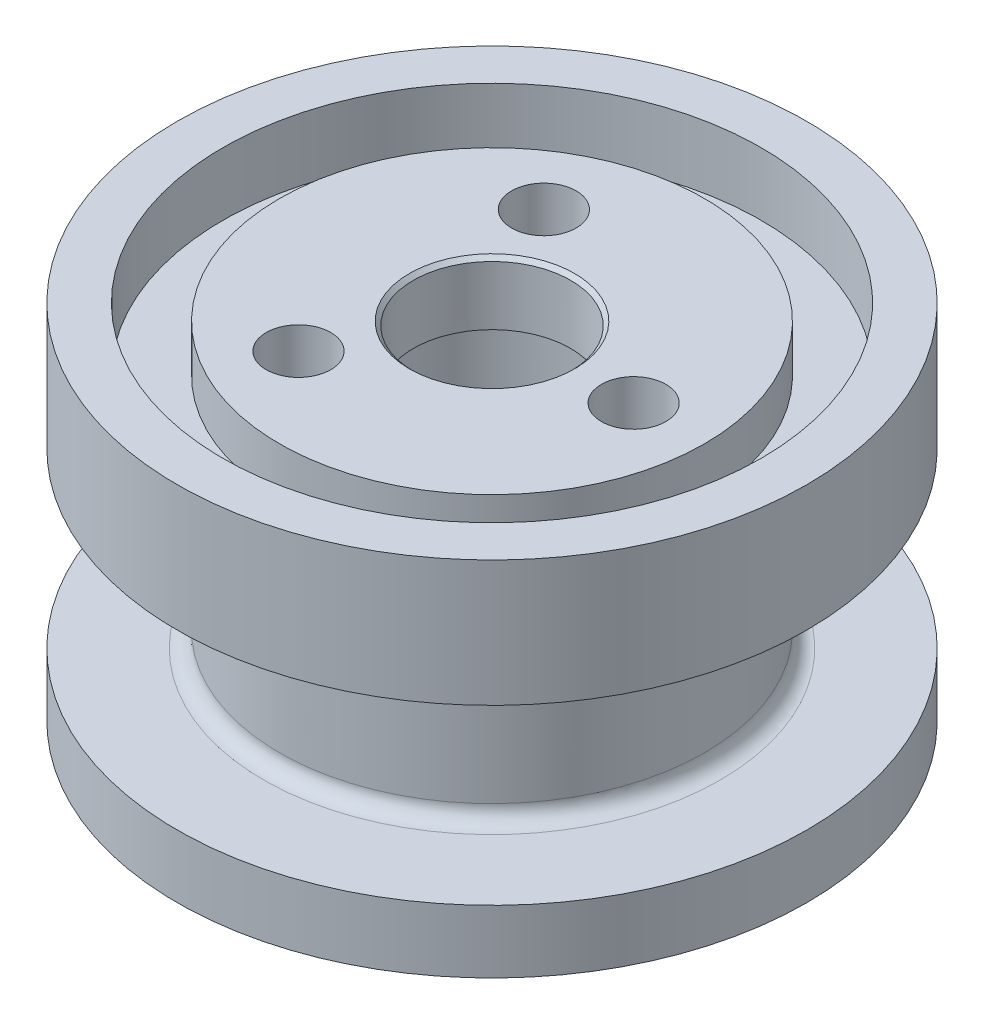
ISO-10303-21;
HEADER;
FILE_DESCRIPTION(('STEP AP214'),'2;1');
FILE_NAME('part.step','',(''),(''),'','','');
FILE_SCHEMA(('AUTOMOTIVE_DESIGN { 1 0 10303 214 1 1 1 1 }'));
ENDSEC;
DATA;
#1=APPLICATION_CONTEXT('core data for automotive mechanical design processes');
#2=APPLICATION_PROTOCOL_DEFINITION('international standard','automotive_design',2000,#1);
#3=PRODUCT_CONTEXT('',#1,'mechanical');
#4=PRODUCT('Part','Part','',(#3));
#5=PRODUCT_RELATED_PRODUCT_CATEGORY('part','',(#4));
#6=PRODUCT_DEFINITION_FORMATION('','',#4);
#7=PRODUCT_DEFINITION_CONTEXT('part definition',#1,'design');
#8=PRODUCT_DEFINITION('design','',#6,#7);
#9=PRODUCT_DEFINITION_SHAPE('','',#8);
#10=(LENGTH_UNIT() NAMED_UNIT(*) SI_UNIT(.MILLI.,.METRE.));
#11=(NAMED_UNIT(*) PLANE_ANGLE_UNIT() SI_UNIT($,.RADIAN.));
#12=(NAMED_UNIT(*) SI_UNIT($,.STERADIAN.) SOLID_ANGLE_UNIT());
#13=UNCERTAINTY_MEASURE_WITH_UNIT(LENGTH_MEASURE(1.E-05),#10,'distance_accuracy_value','');
#14=(GEOMETRIC_REPRESENTATION_CONTEXT(3) GLOBAL_UNCERTAINTY_ASSIGNED_CONTEXT((#13)) GLOBAL_UNIT_ASSIGNED_CONTEXT((#10,
#11,#12)) REPRESENTATION_CONTEXT('',''));
#15=CARTESIAN_POINT('',(0.,0.,0.));
#16=DIRECTION('',(0.,0.,1.));
#17=DIRECTION('',(1.,0.,0.));
#18=AXIS2_PLACEMENT_3D('',#15,#16,#17);
#19=CARTESIAN_POINT('',(0.,0.,0.));
#20=DIRECTION('',(0.,1.,0.));
#21=DIRECTION('',(0.,0.,1.));
#22=AXIS2_PLACEMENT_3D('',#19,#20,#21);
#23=CYLINDRICAL_SURFACE('',#22,6.5);
#24=DIRECTION('',(0.,1.,0.));
#25=VECTOR('',#24,1.);
#26=CARTESIAN_POINT('',(-6.18465843842649,0.,2.));
#27=LINE('',#26,#25);
#28=CARTESIAN_POINT('',(-6.18465843849507,0.250000000116187,2.));
#29=VERTEX_POINT('',#28);
#30=CARTESIAN_POINT('',(-6.18465843842649,6.,2.));
#31=VERTEX_POINT('',#30);
#32=EDGE_CURVE('E61',#29,#31,#27,.T.);
#33=ORIENTED_EDGE('',*,*,#32,.T.);
#34=CARTESIAN_POINT('',(0.,6.,0.));
#35=DIRECTION('',(0.,1.,0.));
#36=DIRECTION('',(0.,0.,1.));
#37=AXIS2_PLACEMENT_3D('',#34,#35,#36);
#38=CIRCLE('',#37,6.5);
#39=CARTESIAN_POINT('',(-6.18465843842649,6.,-2.));
#40=VERTEX_POINT('',#39);
#41=EDGE_CURVE('E20',#31,#40,#38,.F.);
#42=ORIENTED_EDGE('',*,*,#41,.T.);
#43=DIRECTION('',(0.,1.,0.));
#44=VECTOR('',#43,1.);
#45=CARTESIAN_POINT('',(-6.18465843842649,0.,-2.));
#46=LINE('',#45,#44);
#47=CARTESIAN_POINT('',(-6.18465843848511,0.250000000125669,-2.));
#48=VERTEX_POINT('',#47);
#49=EDGE_CURVE('E66',#40,#48,#46,.F.);
#50=ORIENTED_EDGE('',*,*,#49,.T.);
#51=CARTESIAN_POINT('',(0.,0.250000000050932,0.));
#52=DIRECTION('',(0.,-1.,0.));
#53=DIRECTION('',(1.,0.,0.));
#54=AXIS2_PLACEMENT_3D('',#51,#52,#53);
#55=CIRCLE('',#54,6.50000000013051);
#56=EDGE_CURVE('E89',#48,#29,#55,.T.);
#57=ORIENTED_EDGE('',*,*,#56,.T.);
#58=EDGE_LOOP('',(#33,#42,#50,#57));
#59=FACE_BOUND('',#58,.T.);
#60=CARTESIAN_POINT('',(0.,19.5,0.));
#61=DIRECTION('',(0.,-1.,0.));
#62=DIRECTION('',(0.,0.,-1.));
#63=AXIS2_PLACEMENT_3D('',#60,#61,#62);
#64=CIRCLE('',#63,6.5);
#65=CARTESIAN_POINT('',(0.,19.5,-6.5));
#66=VERTEX_POINT('',#65);
#67=EDGE_CURVE('E91',#66,#66,#64,.F.);
#68=ORIENTED_EDGE('',*,*,#67,.T.);
#69=EDGE_LOOP('',(#68));
#70=FACE_BOUND('',#69,.T.);
#71=ADVANCED_FACE('F17',(#59,#70),#23,.F.);
#72=CARTESIAN_POINT('',(-8.,6.,0.));
#73=DIRECTION('',(0.,1.,0.));
#74=DIRECTION('',(0.,0.,1.));
#75=AXIS2_PLACEMENT_3D('',#72,#73,#74);
#76=PLANE('',#75);
#77=DIRECTION('',(1.,0.,0.));
#78=VECTOR('',#77,1.);
#79=CARTESIAN_POINT('',(-0.964836368048555,6.,2.));
#80=LINE('',#79,#78);
#81=CARTESIAN_POINT('',(-8.,6.,2.));
#82=VERTEX_POINT('',#81);
#83=EDGE_CURVE('E85',#31,#82,#80,.F.);
#84=ORIENTED_EDGE('',*,*,#83,.T.);
#85=CARTESIAN_POINT('',(-8.,6.,0.));
#86=DIRECTION('',(0.,1.,0.));
#87=DIRECTION('',(0.,0.,1.));
#88=AXIS2_PLACEMENT_3D('',#85,#86,#87);
#89=CIRCLE('',#88,2.);
#90=CARTESIAN_POINT('',(-8.,6.,-2.));
#91=VERTEX_POINT('',#90);
#92=EDGE_CURVE('E75',#82,#91,#89,.F.);
#93=ORIENTED_EDGE('',*,*,#92,.T.);
#94=DIRECTION('',(-1.,0.,0.));
#95=VECTOR('',#94,1.);
#96=CARTESIAN_POINT('',(-8.,6.,-2.));
#97=LINE('',#96,#95);
#98=EDGE_CURVE('E72',#91,#40,#97,.F.);
#99=ORIENTED_EDGE('',*,*,#98,.T.);
#100=ORIENTED_EDGE('',*,*,#41,.F.);
#101=EDGE_LOOP('',(#84,#93,#99,#100));
#102=FACE_BOUND('',#101,.T.);
#103=ADVANCED_FACE('F73',(#102),#76,.F.);
#104=CARTESIAN_POINT('',(-8.,0.,-2.));
#105=DIRECTION('',(0.,0.,-1.));
#106=DIRECTION('',(-1.,0.,0.));
#107=AXIS2_PLACEMENT_3D('',#104,#105,#106);
#108=PLANE('',#107);
#109=ORIENTED_EDGE('',*,*,#49,.F.);
#110=ORIENTED_EDGE('',*,*,#98,.F.);
#111=DIRECTION('',(0.,1.,0.));
#112=VECTOR('',#111,1.);
#113=CARTESIAN_POINT('',(-8.,0.,-2.));
#114=LINE('',#113,#112);
#115=CARTESIAN_POINT('',(-8.,0.,-2.));
#116=VERTEX_POINT('',#115);
#117=EDGE_CURVE('E156',#91,#116,#114,.F.);
#118=ORIENTED_EDGE('',*,*,#117,.T.);
#119=DIRECTION('',(-1.,0.,0.));
#120=VECTOR('',#119,1.);
#121=CARTESIAN_POINT('',(-8.,0.,-2.));
#122=LINE('',#121,#120);
#123=CARTESIAN_POINT('',(-6.44689847891693,-8.5264717738512E-11,-2.));
#124=VERTEX_POINT('',#123);
#125=EDGE_CURVE('E70',#124,#116,#122,.T.);
#126=ORIENTED_EDGE('',*,*,#125,.F.);
#127=CARTESIAN_POINT('',(-6.44689847901615,-1.42911803351234E-10,-2.0000000000332));
#128=CARTESIAN_POINT('',(-6.40323119374315,0.0417079827790319,-2.0000000000166));
#129=CARTESIAN_POINT('',(-6.35954421449282,0.0833953075033397,-2.00000000000553));
#130=CARTESIAN_POINT('',(-6.27213086766901,0.166728640907955,-1.99999999999447));
#131=CARTESIAN_POINT('',(-6.22840450009521,0.208374649587915,-1.99999999999447));
#132=CARTESIAN_POINT('',(-6.18465843854373,0.25000000006989,-2.));
#133=B_SPLINE_CURVE_WITH_KNOTS('',3,(#127,#128,#129,#130,#131,#132),.UNSPECIFIED.,.F.,.F.,(4,2,
4),(0.,0.181155918446515,0.36231183842027),.UNSPECIFIED.);
#134=EDGE_CURVE('E82',#124,#48,#133,.T.);
#135=ORIENTED_EDGE('',*,*,#134,.T.);
#136=EDGE_LOOP('',(#109,#110,#118,#126,#135));
#137=FACE_BOUND('',#136,.T.);
#138=ADVANCED_FACE('F80',(#137),#108,.F.);
#139=CARTESIAN_POINT('',(-0.964836368048555,0.,2.));
#140=DIRECTION('',(0.,0.,1.));
#141=DIRECTION('',(1.,0.,0.));
#142=AXIS2_PLACEMENT_3D('',#139,#140,#141);
#143=PLANE('',#142);
#144=DIRECTION('',(1.,0.,0.));
#145=VECTOR('',#144,1.);
#146=CARTESIAN_POINT('',(-0.964836368048555,0.,2.));
#147=LINE('',#146,#145);
#148=CARTESIAN_POINT('',(-8.,0.,2.));
#149=VERTEX_POINT('',#148);
#150=CARTESIAN_POINT('',(-6.44689847891693,-8.5264717738512E-11,2.));
#151=VERTEX_POINT('',#150);
#152=EDGE_CURVE('E35',#149,#151,#147,.T.);
#153=ORIENTED_EDGE('',*,*,#152,.F.);
#154=DIRECTION('',(0.,1.,0.));
#155=VECTOR('',#154,1.);
#156=CARTESIAN_POINT('',(-8.,0.,2.));
#157=LINE('',#156,#155);
#158=EDGE_CURVE('E191',#149,#82,#157,.T.);
#159=ORIENTED_EDGE('',*,*,#158,.T.);
#160=ORIENTED_EDGE('',*,*,#83,.F.);
#161=ORIENTED_EDGE('',*,*,#32,.F.);
#162=CARTESIAN_POINT('',(-6.18465843854105,0.250000000067085,1.99999999999516));
#163=CARTESIAN_POINT('',(-6.22840450009696,0.208374649589746,1.99999999999758));
#164=CARTESIAN_POINT('',(-6.27213086767166,0.16672864091072,1.99999999999919));
#165=CARTESIAN_POINT('',(-6.35954421449019,0.0833953075005585,2.00000000000081));
#166=CARTESIAN_POINT('',(-6.40323119373435,0.0417079827697724,2.00000000000081));
#167=CARTESIAN_POINT('',(-6.44689847899765,-1.62354135352145E-10,2.));
#168=B_SPLINE_CURVE_WITH_KNOTS('',3,(#162,#163,#164,#165,#166,#167),.UNSPECIFIED.,.F.,.F.,(4,2,
4),(0.,0.181155919973771,0.362311838420312),.UNSPECIFIED.);
#169=EDGE_CURVE('E90',#29,#151,#168,.T.);
#170=ORIENTED_EDGE('',*,*,#169,.T.);
#171=EDGE_LOOP('',(#153,#159,#160,#161,#170));
#172=FACE_BOUND('',#171,.T.);
#173=ADVANCED_FACE('F184',(#172),#143,.F.);
#174=CARTESIAN_POINT('',(0.,19.5,0.));
#175=DIRECTION('',(0.,-1.,0.));
#176=DIRECTION('',(0.,0.,-1.));
#177=AXIS2_PLACEMENT_3D('',#174,#175,#176);
#178=TOROIDAL_SURFACE('',#177,6.,0.5);
#179=CARTESIAN_POINT('',(0.,20.,0.));
#180=DIRECTION('',(0.,1.,0.));
#181=DIRECTION('',(1.,0.,0.));
#182=AXIS2_PLACEMENT_3D('',#179,#180,#181);
#183=CIRCLE('',#182,6.);
#184=CARTESIAN_POINT('',(6.,20.,0.));
#185=VERTEX_POINT('',#184);
#186=EDGE_CURVE('E154',#185,#185,#183,.T.);
#187=ORIENTED_EDGE('',*,*,#186,.T.);
#188=EDGE_LOOP('',(#187));
#189=FACE_BOUND('',#188,.T.);
#190=ORIENTED_EDGE('',*,*,#67,.F.);
#191=EDGE_LOOP('',(#190));
#192=FACE_BOUND('',#191,.T.);
#193=ADVANCED_FACE('F179',(#189,#192),#178,.F.);
#194=CARTESIAN_POINT('',(0.,1.,0.));
#195=DIRECTION('',(0.,-1.,0.));
#196=DIRECTION('',(1.,0.,0.));
#197=AXIS2_PLACEMENT_3D('',#194,#195,#196);
#198=CYLINDRICAL_SURFACE('',#197,16.);
#199=CARTESIAN_POINT('',(0.,2.,0.));
#200=DIRECTION('',(0.,-1.,0.));
#201=DIRECTION('',(1.,0.,0.));
#202=AXIS2_PLACEMENT_3D('',#199,#200,#201);
#203=CIRCLE('',#202,16.);
#204=CARTESIAN_POINT('',(16.,2.,0.));
#205=VERTEX_POINT('',#204);
#206=EDGE_CURVE('E151',#205,#205,#203,.F.);
#207=ORIENTED_EDGE('',*,*,#206,.F.);
#208=EDGE_LOOP('',(#207));
#209=FACE_BOUND('',#208,.T.);
#210=CARTESIAN_POINT('',(0.,0.,0.));
#211=DIRECTION('',(0.,-1.,0.));
#212=DIRECTION('',(1.,0.,0.));
#213=AXIS2_PLACEMENT_3D('',#210,#211,#212);
#214=CIRCLE('',#213,16.);
#215=CARTESIAN_POINT('',(16.,0.,0.));
#216=VERTEX_POINT('',#215);
#217=EDGE_CURVE('E148',#216,#216,#214,.T.);
#218=ORIENTED_EDGE('',*,*,#217,.F.);
#219=EDGE_LOOP('',(#218));
#220=FACE_BOUND('',#219,.T.);
#221=ADVANCED_FACE('F173',(#209,#220),#198,.T.);
#222=CARTESIAN_POINT('',(0.,-1.13686837721616E-10,0.));
#223=DIRECTION('',(0.,-1.,0.));
#224=DIRECTION('',(0.,0.,-1.));
#225=AXIS2_PLACEMENT_3D('',#222,#223,#224);
#226=CONICAL_SURFACE('',#225,6.74999999984038,0.785398162487954);
#227=CARTESIAN_POINT('',(0.,-1.70530256582424E-10,0.));
#228=DIRECTION('',(0.,-1.,0.));
#229=DIRECTION('',(0.,0.,-1.));
#230=AXIS2_PLACEMENT_3D('',#227,#228,#229);
#231=CIRCLE('',#230,6.74999999989723);
#232=EDGE_CURVE('E145',#151,#124,#231,.F.);
#233=ORIENTED_EDGE('',*,*,#232,.F.);
#234=ORIENTED_EDGE('',*,*,#169,.F.);
#235=ORIENTED_EDGE('',*,*,#56,.F.);
#236=ORIENTED_EDGE('',*,*,#134,.F.);
#237=EDGE_LOOP('',(#233,#234,#235,#236));
#238=FACE_BOUND('',#237,.T.);
#239=ADVANCED_FACE('F167',(#238),#226,.F.);
#240=CARTESIAN_POINT('',(-8.,0.,0.));
#241=DIRECTION('',(0.,1.,0.));
#242=DIRECTION('',(0.,0.,1.));
#243=AXIS2_PLACEMENT_3D('',#240,#241,#242);
#244=CYLINDRICAL_SURFACE('',#243,2.);
#245=CARTESIAN_POINT('',(-8.,0.,0.));
#246=DIRECTION('',(0.,1.,0.));
#247=DIRECTION('',(0.,0.,1.));
#248=AXIS2_PLACEMENT_3D('',#245,#246,#247);
#249=CIRCLE('',#248,2.);
#250=EDGE_CURVE('E142',#116,#149,#249,.T.);
#251=ORIENTED_EDGE('',*,*,#250,.F.);
#252=ORIENTED_EDGE('',*,*,#117,.F.);
#253=ORIENTED_EDGE('',*,*,#92,.F.);
#254=ORIENTED_EDGE('',*,*,#158,.F.);
#255=EDGE_LOOP('',(#251,#252,#253,#254));
#256=FACE_BOUND('',#255,.T.);
#257=ADVANCED_FACE('F172',(#256),#244,.F.);
#258=CARTESIAN_POINT('',(0.,20.,0.));
#259=DIRECTION('',(0.,1.,0.));
#260=DIRECTION('',(0.,0.,1.));
#261=AXIS2_PLACEMENT_3D('',#258,#259,#260);
#262=PLANE('',#261);
#263=CARTESIAN_POINT('',(0.,20.,0.));
#264=DIRECTION('',(0.,-1.,0.));
#265=DIRECTION('',(1.,0.,0.));
#266=AXIS2_PLACEMENT_3D('',#263,#264,#265);
#267=CIRCLE('',#266,5.);
#268=CARTESIAN_POINT('',(5.,20.,0.));
#269=VERTEX_POINT('',#268);
#270=EDGE_CURVE('E139',#269,#269,#267,.F.);
#271=ORIENTED_EDGE('',*,*,#270,.T.);
#272=EDGE_LOOP('',(#271));
#273=FACE_BOUND('',#272,.T.);
#274=ORIENTED_EDGE('',*,*,#186,.F.);
#275=EDGE_LOOP('',(#274));
#276=FACE_BOUND('',#275,.T.);
#277=ADVANCED_FACE('F308',(#273,#276),#262,.F.);
#278=CARTESIAN_POINT('',(18.,2.,0.));
#279=DIRECTION('',(0.,-1.,0.));
#280=DIRECTION('',(0.,0.,-1.));
#281=AXIS2_PLACEMENT_3D('',#278,#279,#280);
#282=PLANE('',#281);
#283=ORIENTED_EDGE('',*,*,#206,.T.);
#284=EDGE_LOOP('',(#283));
#285=FACE_BOUND('',#284,.T.);
#286=CARTESIAN_POINT('',(0.,2.,0.));
#287=DIRECTION('',(0.,-1.,0.));
#288=DIRECTION('',(1.,0.,0.));
#289=AXIS2_PLACEMENT_3D('',#286,#287,#288);
#290=CIRCLE('',#289,20.);
#291=CARTESIAN_POINT('',(20.,2.,0.));
#292=VERTEX_POINT('',#291);
#293=EDGE_CURVE('E136',#292,#292,#290,.F.);
#294=ORIENTED_EDGE('',*,*,#293,.F.);
#295=EDGE_LOOP('',(#294));
#296=FACE_BOUND('',#295,.T.);
#297=ADVANCED_FACE('F317',(#285,#296),#282,.T.);
#298=CARTESIAN_POINT('',(8.,0.,0.));
#299=DIRECTION('',(0.,-1.,0.));
#300=DIRECTION('',(0.,0.,-1.));
#301=AXIS2_PLACEMENT_3D('',#298,#299,#300);
#302=PLANE('',#301);
#303=CARTESIAN_POINT('',(-4.5,0.,-7.79422863405995));
#304=DIRECTION('',(0.,-1.,0.));
#305=DIRECTION('',(0.,0.,-1.));
#306=AXIS2_PLACEMENT_3D('',#303,#304,#305);
#307=CIRCLE('',#306,2.05);
#308=CARTESIAN_POINT('',(-4.5,0.,-9.84422863405995));
#309=VERTEX_POINT('',#308);
#310=EDGE_CURVE('E127',#309,#309,#307,.F.);
#311=ORIENTED_EDGE('',*,*,#310,.T.);
#312=EDGE_LOOP('',(#311));
#313=FACE_BOUND('',#312,.T.);
#314=CARTESIAN_POINT('',(-4.5,0.,7.79422863405995));
#315=DIRECTION('',(0.,-1.,0.));
#316=DIRECTION('',(0.,0.,-1.));
#317=AXIS2_PLACEMENT_3D('',#314,#315,#316);
#318=CIRCLE('',#317,2.05);
#319=CARTESIAN_POINT('',(-4.5,0.,5.74422863405995));
#320=VERTEX_POINT('',#319);
#321=EDGE_CURVE('E130',#320,#320,#318,.F.);
#322=ORIENTED_EDGE('',*,*,#321,.T.);
#323=EDGE_LOOP('',(#322));
#324=FACE_BOUND('',#323,.T.);
#325=CARTESIAN_POINT('',(9.,0.,0.));
#326=DIRECTION('',(0.,-1.,0.));
#327=DIRECTION('',(1.,0.,0.));
#328=AXIS2_PLACEMENT_3D('',#325,#326,#327);
#329=CIRCLE('',#328,2.05);
#330=CARTESIAN_POINT('',(11.05,0.,0.));
#331=VERTEX_POINT('',#330);
#332=EDGE_CURVE('E133',#331,#331,#329,.F.);
#333=ORIENTED_EDGE('',*,*,#332,.T.);
#334=EDGE_LOOP('',(#333));
#335=FACE_BOUND('',#334,.T.);
#336=ORIENTED_EDGE('',*,*,#250,.T.);
#337=ORIENTED_EDGE('',*,*,#152,.T.);
#338=ORIENTED_EDGE('',*,*,#232,.T.);
#339=ORIENTED_EDGE('',*,*,#125,.T.);
#340=EDGE_LOOP('',(#336,#337,#338,#339));
#341=FACE_BOUND('',#340,.T.);
#342=ORIENTED_EDGE('',*,*,#217,.T.);
#343=EDGE_LOOP('',(#342));
#344=FACE_BOUND('',#343,.T.);
#345=ADVANCED_FACE('F209',(#313,#324,#335,#341,#344),#302,.T.);
#346=CARTESIAN_POINT('',(0.,61.8465843842649,0.));
#347=DIRECTION('',(0.,-1.,0.));
#348=DIRECTION('',(1.,0.,0.));
#349=AXIS2_PLACEMENT_3D('',#346,#347,#348);
#350=CYLINDRICAL_SURFACE('',#349,5.);
#351=CARTESIAN_POINT('',(0.,23.7499999998363,0.));
#352=DIRECTION('',(0.,1.,0.));
#353=DIRECTION('',(1.,0.,0.));
#354=AXIS2_PLACEMENT_3D('',#351,#352,#353);
#355=CIRCLE('',#354,5.00000000016598);
#356=CARTESIAN_POINT('',(5.00000000016598,23.7499999998363,0.));
#357=VERTEX_POINT('',#356);
#358=EDGE_CURVE('E126',#357,#357,#355,.T.);
#359=ORIENTED_EDGE('',*,*,#358,.T.);
#360=EDGE_LOOP('',(#359));
#361=FACE_BOUND('',#360,.T.);
#362=ORIENTED_EDGE('',*,*,#270,.F.);
#363=EDGE_LOOP('',(#362));
#364=FACE_BOUND('',#363,.T.);
#365=ADVANCED_FACE('F324',(#361,#364),#350,.F.);
#366=CARTESIAN_POINT('',(0.,4.,0.));
#367=DIRECTION('',(0.,-1.,0.));
#368=DIRECTION('',(1.,0.,0.));
#369=AXIS2_PLACEMENT_3D('',#366,#367,#368);
#370=CYLINDRICAL_SURFACE('',#369,20.);
#371=CARTESIAN_POINT('',(0.,6.,0.));
#372=DIRECTION('',(0.,-1.,0.));
#373=DIRECTION('',(1.,0.,0.));
#374=AXIS2_PLACEMENT_3D('',#371,#372,#373);
#375=CIRCLE('',#374,20.);
#376=CARTESIAN_POINT('',(20.,6.,0.));
#377=VERTEX_POINT('',#376);
#378=EDGE_CURVE('E123',#377,#377,#375,.F.);
#379=ORIENTED_EDGE('',*,*,#378,.F.);
#380=EDGE_LOOP('',(#379));
#381=FACE_BOUND('',#380,.T.);
#382=ORIENTED_EDGE('',*,*,#293,.T.);
#383=EDGE_LOOP('',(#382));
#384=FACE_BOUND('',#383,.T.);
#385=ADVANCED_FACE('F328',(#381,#384),#370,.T.);
#386=CARTESIAN_POINT('',(9.,61.8465843842649,0.));
#387=DIRECTION('',(0.,-1.,0.));
#388=DIRECTION('',(1.,0.,0.));
#389=AXIS2_PLACEMENT_3D('',#386,#387,#388);
#390=CYLINDRICAL_SURFACE('',#389,2.05);
#391=ORIENTED_EDGE('',*,*,#332,.F.);
#392=EDGE_LOOP('',(#391));
#393=FACE_BOUND('',#392,.T.);
#394=CARTESIAN_POINT('',(9.,24.,0.));
#395=DIRECTION('',(0.,-1.,0.));
#396=DIRECTION('',(1.,0.,0.));
#397=AXIS2_PLACEMENT_3D('',#394,#395,#396);
#398=CIRCLE('',#397,2.05);
#399=CARTESIAN_POINT('',(11.05,24.,0.));
#400=VERTEX_POINT('',#399);
#401=EDGE_CURVE('E120',#400,#400,#398,.T.);
#402=ORIENTED_EDGE('',*,*,#401,.F.);
#403=EDGE_LOOP('',(#402));
#404=FACE_BOUND('',#403,.T.);
#405=ADVANCED_FACE('F332',(#393,#404),#390,.F.);
#406=CARTESIAN_POINT('',(-4.5,61.8465843842649,7.79422863405995));
#407=DIRECTION('',(0.,-1.,0.));
#408=DIRECTION('',(0.,0.,-1.));
#409=AXIS2_PLACEMENT_3D('',#406,#407,#408);
#410=CYLINDRICAL_SURFACE('',#409,2.05);
#411=ORIENTED_EDGE('',*,*,#321,.F.);
#412=EDGE_LOOP('',(#411));
#413=FACE_BOUND('',#412,.T.);
#414=CARTESIAN_POINT('',(-4.5,24.,7.79422863405995));
#415=DIRECTION('',(0.,-1.,0.));
#416=DIRECTION('',(0.,0.,-1.));
#417=AXIS2_PLACEMENT_3D('',#414,#415,#416);
#418=CIRCLE('',#417,2.05);
#419=CARTESIAN_POINT('',(-4.5,24.,5.74422863405995));
#420=VERTEX_POINT('',#419);
#421=EDGE_CURVE('E117',#420,#420,#418,.T.);
#422=ORIENTED_EDGE('',*,*,#421,.F.);
#423=EDGE_LOOP('',(#422));
#424=FACE_BOUND('',#423,.T.);
#425=ADVANCED_FACE('F336',(#413,#424),#410,.F.);
#426=CARTESIAN_POINT('',(-4.5,61.8465843842649,-7.79422863405995));
#427=DIRECTION('',(0.,-1.,0.));
#428=DIRECTION('',(0.,0.,-1.));
#429=AXIS2_PLACEMENT_3D('',#426,#427,#428);
#430=CYLINDRICAL_SURFACE('',#429,2.05);
#431=ORIENTED_EDGE('',*,*,#310,.F.);
#432=EDGE_LOOP('',(#431));
#433=FACE_BOUND('',#432,.T.);
#434=CARTESIAN_POINT('',(-4.5,24.,-7.79422863405995));
#435=DIRECTION('',(0.,-1.,0.));
#436=DIRECTION('',(0.,0.,-1.));
#437=AXIS2_PLACEMENT_3D('',#434,#435,#436);
#438=CIRCLE('',#437,2.05);
#439=CARTESIAN_POINT('',(-4.5,24.,-9.84422863405995));
#440=VERTEX_POINT('',#439);
#441=EDGE_CURVE('E114',#440,#440,#438,.T.);
#442=ORIENTED_EDGE('',*,*,#441,.F.);
#443=EDGE_LOOP('',(#442));
#444=FACE_BOUND('',#443,.T.);
#445=ADVANCED_FACE('F340',(#433,#444),#430,.F.);
#446=CARTESIAN_POINT('',(0.,24.0000000000009,0.));
#447=DIRECTION('',(0.,1.,0.));
#448=DIRECTION('',(0.,0.,1.));
#449=AXIS2_PLACEMENT_3D('',#446,#447,#448);
#450=CONICAL_SURFACE('',#449,5.24999999987585,0.785398162487954);
#451=CARTESIAN_POINT('',(0.,24.0000000000578,0.));
#452=DIRECTION('',(0.,1.,0.));
#453=DIRECTION('',(0.,0.,1.));
#454=AXIS2_PLACEMENT_3D('',#451,#452,#453);
#455=CIRCLE('',#454,5.2499999999327);
#456=CARTESIAN_POINT('',(0.,24.0000000000578,5.2499999999327));
#457=VERTEX_POINT('',#456);
#458=EDGE_CURVE('E111',#457,#457,#455,.F.);
#459=ORIENTED_EDGE('',*,*,#458,.F.);
#460=EDGE_LOOP('',(#459));
#461=FACE_BOUND('',#460,.T.);
#462=ORIENTED_EDGE('',*,*,#358,.F.);
#463=EDGE_LOOP('',(#462));
#464=FACE_BOUND('',#463,.T.);
#465=ADVANCED_FACE('F344',(#461,#464),#450,.F.);
#466=CARTESIAN_POINT('',(16.75,6.,0.));
#467=DIRECTION('',(0.,1.,0.));
#468=DIRECTION('',(0.,0.,1.));
#469=AXIS2_PLACEMENT_3D('',#466,#467,#468);
#470=PLANE('',#469);
#471=CARTESIAN_POINT('',(0.,6.,0.));
#472=DIRECTION('',(0.,1.,0.));
#473=DIRECTION('',(1.,0.,0.));
#474=AXIS2_PLACEMENT_3D('',#471,#472,#473);
#475=CIRCLE('',#474,14.5);
#476=CARTESIAN_POINT('',(14.5,6.,0.));
#477=VERTEX_POINT('',#476);
#478=EDGE_CURVE('E110',#477,#477,#475,.F.);
#479=ORIENTED_EDGE('',*,*,#478,.T.);
#480=EDGE_LOOP('',(#479));
#481=FACE_BOUND('',#480,.T.);
#482=ORIENTED_EDGE('',*,*,#378,.T.);
#483=EDGE_LOOP('',(#482));
#484=FACE_BOUND('',#483,.T.);
#485=ADVANCED_FACE('F347',(#481,#484),#470,.T.);
#486=CARTESIAN_POINT('',(6.75,24.,0.));
#487=DIRECTION('',(0.,1.,0.));
#488=DIRECTION('',(0.,0.,1.));
#489=AXIS2_PLACEMENT_3D('',#486,#487,#488);
#490=PLANE('',#489);
#491=ORIENTED_EDGE('',*,*,#458,.T.);
#492=EDGE_LOOP('',(#491));
#493=FACE_BOUND('',#492,.T.);
#494=ORIENTED_EDGE('',*,*,#441,.T.);
#495=EDGE_LOOP('',(#494));
#496=FACE_BOUND('',#495,.T.);
#497=ORIENTED_EDGE('',*,*,#421,.T.);
#498=EDGE_LOOP('',(#497));
#499=FACE_BOUND('',#498,.T.);
#500=ORIENTED_EDGE('',*,*,#401,.T.);
#501=EDGE_LOOP('',(#500));
#502=FACE_BOUND('',#501,.T.);
#503=CARTESIAN_POINT('',(0.,24.,0.));
#504=DIRECTION('',(0.,-1.,0.));
#505=DIRECTION('',(1.,0.,0.));
#506=AXIS2_PLACEMENT_3D('',#503,#504,#505);
#507=CIRCLE('',#506,13.5);
#508=CARTESIAN_POINT('',(13.5,24.,0.));
#509=VERTEX_POINT('',#508);
#510=EDGE_CURVE('E107',#509,#509,#507,.T.);
#511=ORIENTED_EDGE('',*,*,#510,.F.);
#512=EDGE_LOOP('',(#511));
#513=FACE_BOUND('',#512,.T.);
#514=ADVANCED_FACE('F286',(#493,#496,#499,#502,#513),#490,.T.);
#515=CARTESIAN_POINT('',(0.,7.,0.));
#516=DIRECTION('',(0.,-1.,0.));
#517=DIRECTION('',(0.,0.,-1.));
#518=AXIS2_PLACEMENT_3D('',#515,#516,#517);
#519=TOROIDAL_SURFACE('',#518,14.5,1.);
#520=ORIENTED_EDGE('',*,*,#478,.F.);
#521=EDGE_LOOP('',(#520));
#522=FACE_BOUND('',#521,.T.);
#523=CARTESIAN_POINT('',(0.,7.,0.));
#524=DIRECTION('',(0.,-1.,0.));
#525=DIRECTION('',(1.,0.,0.));
#526=AXIS2_PLACEMENT_3D('',#523,#524,#525);
#527=CIRCLE('',#526,13.5);
#528=CARTESIAN_POINT('',(13.5,7.,0.));
#529=VERTEX_POINT('',#528);
#530=EDGE_CURVE('E106',#529,#529,#527,.F.);
#531=ORIENTED_EDGE('',*,*,#530,.F.);
#532=EDGE_LOOP('',(#531));
#533=FACE_BOUND('',#532,.T.);
#534=ADVANCED_FACE('F280',(#522,#533),#519,.F.);
#535=CARTESIAN_POINT('',(0.,22.5,0.));
#536=DIRECTION('',(0.,-1.,0.));
#537=DIRECTION('',(1.,0.,0.));
#538=AXIS2_PLACEMENT_3D('',#535,#536,#537);
#539=CYLINDRICAL_SURFACE('',#538,13.5);
#540=ORIENTED_EDGE('',*,*,#510,.T.);
#541=EDGE_LOOP('',(#540));
#542=FACE_BOUND('',#541,.T.);
#543=CARTESIAN_POINT('',(0.,21.,0.));
#544=DIRECTION('',(0.,-1.,0.));
#545=DIRECTION('',(1.,0.,0.));
#546=AXIS2_PLACEMENT_3D('',#543,#544,#545);
#547=CIRCLE('',#546,13.5);
#548=CARTESIAN_POINT('',(13.5,21.,0.));
#549=VERTEX_POINT('',#548);
#550=EDGE_CURVE('E103',#549,#549,#547,.T.);
#551=ORIENTED_EDGE('',*,*,#550,.F.);
#552=EDGE_LOOP('',(#551));
#553=FACE_BOUND('',#552,.T.);
#554=ADVANCED_FACE('F285',(#542,#553),#539,.T.);
#555=CARTESIAN_POINT('',(0.,11.5,0.));
#556=DIRECTION('',(0.,-1.,0.));
#557=DIRECTION('',(1.,0.,0.));
#558=AXIS2_PLACEMENT_3D('',#555,#556,#557);
#559=CYLINDRICAL_SURFACE('',#558,13.5);
#560=ORIENTED_EDGE('',*,*,#530,.T.);
#561=EDGE_LOOP('',(#560));
#562=FACE_BOUND('',#561,.T.);
#563=CARTESIAN_POINT('',(0.,16.,0.));
#564=DIRECTION('',(0.,-1.,0.));
#565=DIRECTION('',(0.,0.,-1.));
#566=AXIS2_PLACEMENT_3D('',#563,#564,#565);
#567=CIRCLE('',#566,13.5);
#568=CARTESIAN_POINT('',(0.,16.,-13.5));
#569=VERTEX_POINT('',#568);
#570=EDGE_CURVE('E102',#569,#569,#567,.T.);
#571=ORIENTED_EDGE('',*,*,#570,.T.);
#572=EDGE_LOOP('',(#571));
#573=FACE_BOUND('',#572,.T.);
#574=ADVANCED_FACE('F371',(#562,#573),#559,.T.);
#575=CARTESIAN_POINT('',(15.3,21.,0.));
#576=DIRECTION('',(0.,1.,0.));
#577=DIRECTION('',(0.,0.,1.));
#578=AXIS2_PLACEMENT_3D('',#575,#576,#577);
#579=PLANE('',#578);
#580=ORIENTED_EDGE('',*,*,#550,.T.);
#581=EDGE_LOOP('',(#580));
#582=FACE_BOUND('',#581,.T.);
#583=CARTESIAN_POINT('',(0.,21.,0.));
#584=DIRECTION('',(0.,-1.,0.));
#585=DIRECTION('',(1.,0.,0.));
#586=AXIS2_PLACEMENT_3D('',#583,#584,#585);
#587=CIRCLE('',#586,17.1);
#588=CARTESIAN_POINT('',(17.1,21.,0.));
#589=VERTEX_POINT('',#588);
#590=EDGE_CURVE('E99',#589,#589,#587,.F.);
#591=ORIENTED_EDGE('',*,*,#590,.T.);
#592=EDGE_LOOP('',(#591));
#593=FACE_BOUND('',#592,.T.);
#594=ADVANCED_FACE('F257',(#582,#593),#579,.T.);
#595=CARTESIAN_POINT('',(0.,16.,0.));
#596=DIRECTION('',(0.,-1.,0.));
#597=DIRECTION('',(0.,0.,-1.));
#598=AXIS2_PLACEMENT_3D('',#595,#596,#597);
#599=TOROIDAL_SURFACE('',#598,14.5,1.);
#600=ORIENTED_EDGE('',*,*,#570,.F.);
#601=EDGE_LOOP('',(#600));
#602=FACE_BOUND('',#601,.T.);
#603=CARTESIAN_POINT('',(0.,17.,0.));
#604=DIRECTION('',(0.,-1.,0.));
#605=DIRECTION('',(1.,0.,0.));
#606=AXIS2_PLACEMENT_3D('',#603,#604,#605);
#607=CIRCLE('',#606,14.5);
#608=CARTESIAN_POINT('',(14.5,17.,0.));
#609=VERTEX_POINT('',#608);
#610=EDGE_CURVE('E98',#609,#609,#607,.F.);
#611=ORIENTED_EDGE('',*,*,#610,.F.);
#612=EDGE_LOOP('',(#611));
#613=FACE_BOUND('',#612,.T.);
#614=ADVANCED_FACE('F253',(#602,#613),#599,.F.);
#615=CARTESIAN_POINT('',(0.,23.,0.));
#616=DIRECTION('',(0.,-1.,0.));
#617=DIRECTION('',(1.,0.,0.));
#618=AXIS2_PLACEMENT_3D('',#615,#616,#617);
#619=CYLINDRICAL_SURFACE('',#618,17.1);
#620=ORIENTED_EDGE('',*,*,#590,.F.);
#621=EDGE_LOOP('',(#620));
#622=FACE_BOUND('',#621,.T.);
#623=CARTESIAN_POINT('',(0.,25.,0.));
#624=DIRECTION('',(0.,-1.,0.));
#625=DIRECTION('',(1.,0.,0.));
#626=AXIS2_PLACEMENT_3D('',#623,#624,#625);
#627=CIRCLE('',#626,17.1);
#628=CARTESIAN_POINT('',(17.1,25.,0.));
#629=VERTEX_POINT('',#628);
#630=EDGE_CURVE('E95',#629,#629,#627,.T.);
#631=ORIENTED_EDGE('',*,*,#630,.F.);
#632=EDGE_LOOP('',(#631));
#633=FACE_BOUND('',#632,.T.);
#634=ADVANCED_FACE('F236',(#622,#633),#619,.F.);
#635=CARTESIAN_POINT('',(16.75,17.,0.));
#636=DIRECTION('',(0.,-1.,0.));
#637=DIRECTION('',(0.,0.,-1.));
#638=AXIS2_PLACEMENT_3D('',#635,#636,#637);
#639=PLANE('',#638);
#640=ORIENTED_EDGE('',*,*,#610,.T.);
#641=EDGE_LOOP('',(#640));
#642=FACE_BOUND('',#641,.T.);
#643=CARTESIAN_POINT('',(0.,17.,0.));
#644=DIRECTION('',(0.,-1.,0.));
#645=DIRECTION('',(1.,0.,0.));
#646=AXIS2_PLACEMENT_3D('',#643,#644,#645);
#647=CIRCLE('',#646,20.);
#648=CARTESIAN_POINT('',(20.,17.,0.));
#649=VERTEX_POINT('',#648);
#650=EDGE_CURVE('E26',#649,#649,#647,.F.);
#651=ORIENTED_EDGE('',*,*,#650,.F.);
#652=EDGE_LOOP('',(#651));
#653=FACE_BOUND('',#652,.T.);
#654=ADVANCED_FACE('F228',(#642,#653),#639,.T.);
#655=CARTESIAN_POINT('',(18.55,25.,0.));
#656=DIRECTION('',(0.,1.,0.));
#657=DIRECTION('',(0.,0.,1.));
#658=AXIS2_PLACEMENT_3D('',#655,#656,#657);
#659=PLANE('',#658);
#660=ORIENTED_EDGE('',*,*,#630,.T.);
#661=EDGE_LOOP('',(#660));
#662=FACE_BOUND('',#661,.T.);
#663=CARTESIAN_POINT('',(0.,25.,0.));
#664=DIRECTION('',(0.,-1.,0.));
#665=DIRECTION('',(1.,0.,0.));
#666=AXIS2_PLACEMENT_3D('',#663,#664,#665);
#667=CIRCLE('',#666,20.);
#668=CARTESIAN_POINT('',(20.,25.,0.));
#669=VERTEX_POINT('',#668);
#670=EDGE_CURVE('E11',#669,#669,#667,.T.);
#671=ORIENTED_EDGE('',*,*,#670,.F.);
#672=EDGE_LOOP('',(#671));
#673=FACE_BOUND('',#672,.T.);
#674=ADVANCED_FACE('F222',(#662,#673),#659,.T.);
#675=CARTESIAN_POINT('',(0.,21.,0.));
#676=DIRECTION('',(0.,-1.,0.));
#677=DIRECTION('',(1.,0.,0.));
#678=AXIS2_PLACEMENT_3D('',#675,#676,#677);
#679=CYLINDRICAL_SURFACE('',#678,20.);
#680=ORIENTED_EDGE('',*,*,#670,.T.);
#681=EDGE_LOOP('',(#680));
#682=FACE_BOUND('',#681,.T.);
#683=ORIENTED_EDGE('',*,*,#650,.T.);
#684=EDGE_LOOP('',(#683));
#685=FACE_BOUND('',#684,.T.);
#686=ADVANCED_FACE('F220',(#682,#685),#679,.T.);
#687=CLOSED_SHELL('',(#71,#103,#138,#173,#193,#221,#239,#257,#277,#297,#345,#365,#385,#405,#425,
#445,#465,#485,#514,#534,#554,#574,#594,#614,#634,#654,#674,#686));
#688=MANIFOLD_SOLID_BREP('B1',#687);
#689=ADVANCED_BREP_SHAPE_REPRESENTATION('',(#18,#688),#14);
#690=SHAPE_DEFINITION_REPRESENTATION(#9,#689);
ENDSEC;
END-ISO-10303-21;
